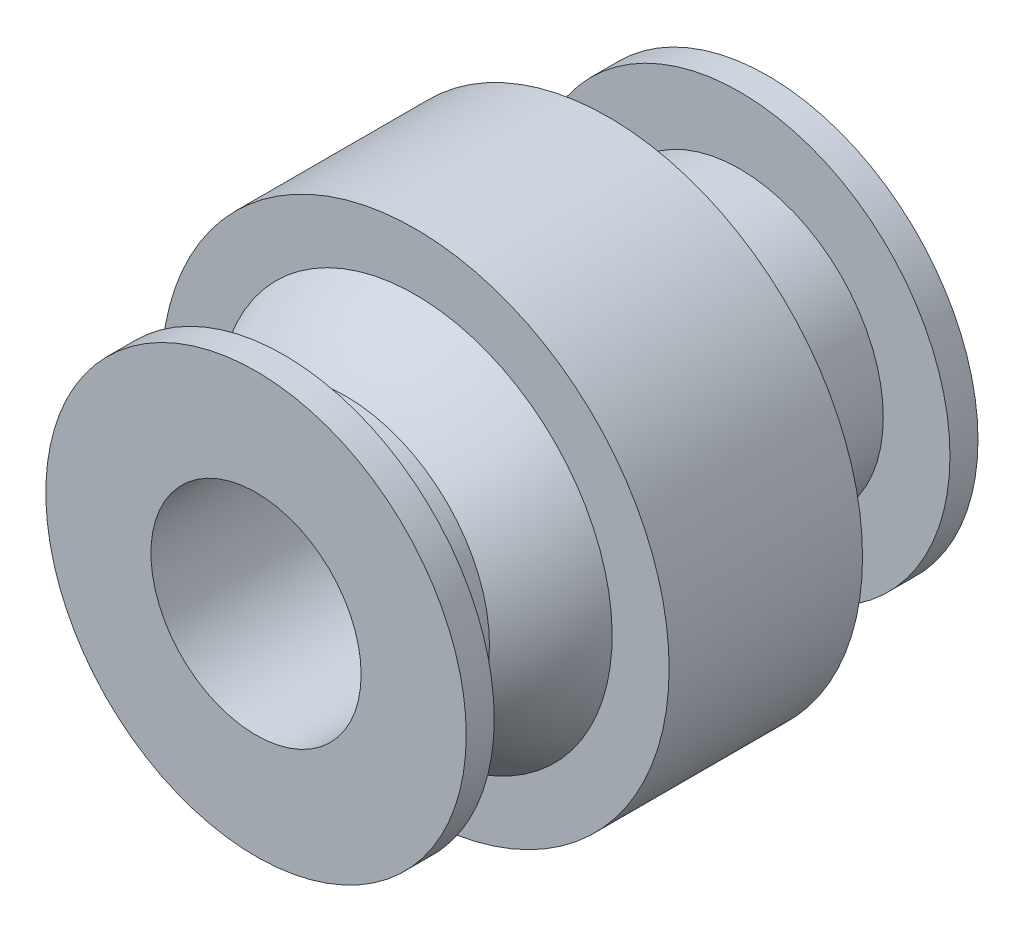
ISO-10303-21;
HEADER;
FILE_DESCRIPTION(('STEP AP214'),'2;1');
FILE_NAME('part.step','',(''),(''),'','','');
FILE_SCHEMA(('AUTOMOTIVE_DESIGN { 1 0 10303 214 1 1 1 1 }'));
ENDSEC;
DATA;
#1=APPLICATION_CONTEXT('core data for automotive mechanical design processes');
#2=APPLICATION_PROTOCOL_DEFINITION('international standard','automotive_design',2000,#1);
#3=PRODUCT_CONTEXT('',#1,'mechanical');
#4=PRODUCT('Part','Part','',(#3));
#5=PRODUCT_RELATED_PRODUCT_CATEGORY('part','',(#4));
#6=PRODUCT_DEFINITION_FORMATION('','',#4);
#7=PRODUCT_DEFINITION_CONTEXT('part definition',#1,'design');
#8=PRODUCT_DEFINITION('design','',#6,#7);
#9=PRODUCT_DEFINITION_SHAPE('','',#8);
#10=(LENGTH_UNIT() NAMED_UNIT(*) SI_UNIT(.MILLI.,.METRE.));
#11=(NAMED_UNIT(*) PLANE_ANGLE_UNIT() SI_UNIT($,.RADIAN.));
#12=(NAMED_UNIT(*) SI_UNIT($,.STERADIAN.) SOLID_ANGLE_UNIT());
#13=UNCERTAINTY_MEASURE_WITH_UNIT(LENGTH_MEASURE(1.E-05),#10,'distance_accuracy_value','');
#14=(GEOMETRIC_REPRESENTATION_CONTEXT(3) GLOBAL_UNCERTAINTY_ASSIGNED_CONTEXT((#13)) GLOBAL_UNIT_ASSIGNED_CONTEXT((#10,
#11,#12)) REPRESENTATION_CONTEXT('',''));
#15=CARTESIAN_POINT('',(0.,0.,0.));
#16=DIRECTION('',(0.,0.,1.));
#17=DIRECTION('',(1.,0.,0.));
#18=AXIS2_PLACEMENT_3D('',#15,#16,#17);
#19=CARTESIAN_POINT('',(0.,-31.574232,-60.7949));
#20=DIRECTION('',(0.,0.,-1.));
#21=DIRECTION('',(-1.,0.,0.));
#22=AXIS2_PLACEMENT_3D('',#19,#20,#21);
#23=PLANE('',#22);
#24=CARTESIAN_POINT('',(0.,-22.049232,-60.7949));
#25=DIRECTION('',(0.,0.,1.));
#26=DIRECTION('',(1.,0.,0.));
#27=AXIS2_PLACEMENT_3D('',#24,#25,#26);
#28=CIRCLE('',#27,6.5024);
#29=CARTESIAN_POINT('',(6.5024,-22.049232,-60.7949));
#30=VERTEX_POINT('',#29);
#31=EDGE_CURVE('E10',#30,#30,#28,.T.);
#32=ORIENTED_EDGE('',*,*,#31,.T.);
#33=EDGE_LOOP('',(#32));
#34=FACE_BOUND('',#33,.T.);
#35=CARTESIAN_POINT('',(0.,-22.049232,-60.7949));
#36=DIRECTION('',(0.,0.,1.));
#37=DIRECTION('',(1.,0.,0.));
#38=AXIS2_PLACEMENT_3D('',#35,#36,#37);
#39=CIRCLE('',#38,9.525);
#40=CARTESIAN_POINT('',(9.525,-22.049232,-60.7949));
#41=VERTEX_POINT('',#40);
#42=EDGE_CURVE('E102',#41,#41,#39,.T.);
#43=ORIENTED_EDGE('',*,*,#42,.F.);
#44=EDGE_LOOP('',(#43));
#45=FACE_BOUND('',#44,.T.);
#46=ADVANCED_FACE('F43',(#34,#45),#23,.T.);
#47=CARTESIAN_POINT('',(0.,-22.049232,-82.1361730867633));
#48=DIRECTION('',(0.,0.,1.));
#49=DIRECTION('',(1.,0.,0.));
#50=AXIS2_PLACEMENT_3D('',#47,#48,#49);
#51=CYLINDRICAL_SURFACE('',#50,6.5024);
#52=CARTESIAN_POINT('',(0.,-22.049232,-63.6000069614774));
#53=DIRECTION('',(0.,0.,1.));
#54=DIRECTION('',(1.,0.,0.));
#55=AXIS2_PLACEMENT_3D('',#52,#53,#54);
#56=CIRCLE('',#55,6.5024);
#57=CARTESIAN_POINT('',(0.,-28.551632,-63.6000069614774));
#58=VERTEX_POINT('',#57);
#59=EDGE_CURVE('E50',#58,#58,#56,.T.);
#60=ORIENTED_EDGE('',*,*,#59,.T.);
#61=EDGE_LOOP('',(#60));
#62=FACE_BOUND('',#61,.T.);
#63=ORIENTED_EDGE('',*,*,#31,.F.);
#64=EDGE_LOOP('',(#63));
#65=FACE_BOUND('',#64,.T.);
#66=ADVANCED_FACE('F111',(#62,#65),#51,.T.);
#67=CARTESIAN_POINT('',(0.,-22.049232,-71.12));
#68=DIRECTION('',(0.,0.,1.));
#69=DIRECTION('',(0.,-1.,0.));
#70=AXIS2_PLACEMENT_3D('',#67,#68,#69);
#71=SPHERICAL_SURFACE('',#70,9.94140337474685);
#72=CARTESIAN_POINT('',(0.,-22.049232,-66.7385));
#73=DIRECTION('',(0.,0.,1.));
#74=DIRECTION('',(1.,0.,0.));
#75=AXIS2_PLACEMENT_3D('',#72,#73,#74);
#76=CIRCLE('',#75,8.92378612526253);
#77=CARTESIAN_POINT('',(0.,-30.9730181252625,-66.7385));
#78=VERTEX_POINT('',#77);
#79=EDGE_CURVE('E55',#78,#78,#76,.T.);
#80=CARTESIAN_POINT('',(0.,-30.9730181252625,-66.7385));
#81=CARTESIAN_POINT('',(0.,-30.9546968172942,-66.7011850210384));
#82=CARTESIAN_POINT('',(0.,-30.9361414336475,-66.6639849715197));
#83=CARTESIAN_POINT('',(0.,-30.8985654926746,-66.5898205560576));
#84=CARTESIAN_POINT('',(0.,-30.8795449353484,-66.5528561901143));
#85=CARTESIAN_POINT('',(0.,-30.8410416246939,-66.4791689664927));
#86=CARTESIAN_POINT('',(0.,-30.8215588713656,-66.4424461088144));
#87=CARTESIAN_POINT('',(0.,-30.7821342387314,-66.3692476784703));
#88=CARTESIAN_POINT('',(0.,-30.7621923594254,-66.3327721058044));
#89=CARTESIAN_POINT('',(0.,-30.7218526118547,-66.2600739859813));
#90=CARTESIAN_POINT('',(0.,-30.7014547435899,-66.2238514388242));
#91=CARTESIAN_POINT('',(0.,-30.6602062282843,-66.1516650699845));
#92=CARTESIAN_POINT('',(0.,-30.6393555812437,-66.115701248302));
#93=CARTESIAN_POINT('',(0.,-30.5972047894432,-66.0440379898545));
#94=CARTESIAN_POINT('',(0.,-30.5759046446834,-66.0083385530896));
#95=CARTESIAN_POINT('',(0.,-30.5328582093371,-65.9372096822646));
#96=CARTESIAN_POINT('',(0.,-30.5111119187507,-65.9017802482044));
#97=CARTESIAN_POINT('',(0.,-30.4671766138237,-65.8311969581013));
#98=CARTESIAN_POINT('',(0.,-30.4449875994832,-65.7960431020582));
#99=CARTESIAN_POINT('',(0.,-30.4001703387966,-65.7260164999317));
#100=CARTESIAN_POINT('',(0.,-30.3775420924505,-65.6911437538483));
#101=CARTESIAN_POINT('',(0.,-30.3318499286185,-65.6216848593482));
#102=CARTESIAN_POINT('',(0.,-30.3087860111326,-65.5870987109315));
#103=CARTESIAN_POINT('',(0.,-30.2622261344462,-65.5182184543714));
#104=CARTESIAN_POINT('',(0.,-30.2387301752457,-65.4839243462281));
#105=CARTESIAN_POINT('',(0.,-30.1913099125428,-65.4156335668651));
#106=CARTESIAN_POINT('',(0.,-30.1673856090403,-65.3816368956454));
#107=CARTESIAN_POINT('',(0.,-30.1191124225522,-65.3139463399739));
#108=CARTESIAN_POINT('',(0.,-30.0947635395665,-65.2802524555222));
#109=CARTESIAN_POINT('',(0.,-30.0456450257438,-65.2131727755835));
#110=CARTESIAN_POINT('',(0.,-30.0208753949069,-65.1797869800965));
#111=CARTESIAN_POINT('',(0.,-29.9709192832243,-65.1133287318019));
#112=CARTESIAN_POINT('',(0.,-29.9457328023786,-65.0802562789943));
#113=CARTESIAN_POINT('',(0.,-29.8949469541182,-65.0144299204645));
#114=CARTESIAN_POINT('',(0.,-29.8693475867035,-64.9816760147422));
#115=CARTESIAN_POINT('',(0.,-29.8177399937179,-64.9164919046612));
#116=CARTESIAN_POINT('',(0.,-29.7917317681471,-64.8840617003024));
#117=CARTESIAN_POINT('',(0.,-29.7393105516018,-64.8195300962874));
#118=CARTESIAN_POINT('',(0.,-29.7128975606273,-64.7874286966313));
#119=CARTESIAN_POINT('',(0.,-29.6596709697226,-64.7235597536191));
#120=CARTESIAN_POINT('',(0.,-29.6328573697924,-64.6917922102631));
#121=CARTESIAN_POINT('',(0.,-29.5788337804654,-64.6285959789114));
#122=CARTESIAN_POINT('',(0.,-29.5516237910686,-64.5971672909158));
#123=CARTESIAN_POINT('',(0.,-29.4968117046751,-64.5346537160218));
#124=CARTESIAN_POINT('',(0.,-29.4692096076784,-64.5035688291235));
#125=CARTESIAN_POINT('',(0.,-29.4136176496549,-64.4417477480594));
#126=CARTESIAN_POINT('',(0.,-29.3856277886281,-64.4110115538935));
#127=CARTESIAN_POINT('',(0.,-29.3292647071351,-64.3498926950573));
#128=CARTESIAN_POINT('',(0.,-29.3008914866688,-64.319510030387));
#129=CARTESIAN_POINT('',(0.,-29.2437661512124,-64.2591030116738));
#130=CARTESIAN_POINT('',(0.,-29.2150140362224,-64.229078657631));
#131=CARTESIAN_POINT('',(0.,-29.157135436264,-64.1693929849136));
#132=CARTESIAN_POINT('',(0.,-29.1280089512957,-64.139731666239));
#133=CARTESIAN_POINT('',(0.,-29.0693861948185,-64.0807767318931));
#134=CARTESIAN_POINT('',(0.,-29.0398899233096,-64.0514831162218));
#135=CARTESIAN_POINT('',(0.,-28.980532235455,-63.9932681975692));
#136=CARTESIAN_POINT('',(0.,-28.9506708191094,-63.964346894588));
#137=CARTESIAN_POINT('',(0.,-28.890587540465,-63.9068811527306));
#138=CARTESIAN_POINT('',(0.,-28.8603656781663,-63.8783367138544));
#139=CARTESIAN_POINT('',(0.,-28.7995662642682,-63.8216291911362));
#140=CARTESIAN_POINT('',(0.,-28.7689887126688,-63.7934661072941));
#141=CARTESIAN_POINT('',(0.,-28.7074827288851,-63.7375257299696));
#142=CARTESIAN_POINT('',(0.,-28.6765542967007,-63.7097484364872));
#143=CARTESIAN_POINT('',(0.,-28.6143514302681,-63.6545839980472));
#144=CARTESIAN_POINT('',(0.,-28.5830769960198,-63.6271968530898));
#145=CARTESIAN_POINT('',(0.,-28.551632,-63.6000069614774));
#146=B_SPLINE_CURVE_WITH_KNOTS('',3,(#80,#81,#82,#83,#84,#85,#86,#87,#88,#89,#90,#91,#92,#93,
#94,#95,#96,#97,#98,#99,#100,#101,#102,#103,#104,#105,#106,#107,#108,#109,#110,#111,#112,#113,
#114,#115,#116,#117,#118,#119,#120,#121,#122,#123,#124,#125,#126,#127,#128,#129,#130,#131,#132,
#133,#134,#135,#136,#137,#138,#139,#140,#141,#142,#143,#144,#145),.UNSPECIFIED.,.F.,.F.,(4,2,2,
2,2,2,2,2,2,2,2,2,2,2,2,2,2,2,2,2,2,2,2,2,2,2,2,2,2,2,2,2,4),(0.,0.124709653743761,
0.249419307487528,0.374128961231285,0.49883861497504,0.62354826871879,0.748257922462551,
0.872967576206311,0.997677229950065,1.12238688369382,1.24709653743757,1.37180619118134,
1.49651584492509,1.62122549866885,1.74593515241261,1.87064480615637,1.99535445990012,
2.12006411364388,2.24477376738763,2.3694834211314,2.49419307487515,2.61890272861891,
2.74361238236267,2.86832203610643,2.99303168985017,3.11774134359393,3.24245099733769,
3.36716065108145,3.4918703048252,3.61657995856896,3.74128961231272,3.86599926605648,
3.99070891980024),.UNSPECIFIED.);
#147=EDGE_CURVE('BSEAM115',#78,#58,#146,.T.);
#148=ORIENTED_EDGE('',*,*,#79,.T.);
#149=ORIENTED_EDGE('',*,*,#59,.F.);
#150=ORIENTED_EDGE('',*,*,#147,.T.);
#151=ORIENTED_EDGE('',*,*,#147,.F.);
#152=EDGE_LOOP('',(#148,#150,#149,#151));
#153=FACE_BOUND('',#152,.T.);
#154=ADVANCED_FACE('F115',(#153),#71,.T.);
#155=CARTESIAN_POINT('',(0.,-30.9730181252625,-66.7385));
#156=DIRECTION('',(0.,0.,1.));
#157=DIRECTION('',(1.,0.,0.));
#158=AXIS2_PLACEMENT_3D('',#155,#156,#157);
#159=PLANE('',#158);
#160=CARTESIAN_POINT('',(0.,-22.049232,-66.7385));
#161=DIRECTION('',(0.,0.,1.));
#162=DIRECTION('',(1.,0.,0.));
#163=AXIS2_PLACEMENT_3D('',#160,#161,#162);
#164=CIRCLE('',#163,11.5062);
#165=CARTESIAN_POINT('',(11.5062,-22.049232,-66.7385));
#166=VERTEX_POINT('',#165);
#167=EDGE_CURVE('E60',#166,#166,#164,.T.);
#168=ORIENTED_EDGE('',*,*,#167,.T.);
#169=EDGE_LOOP('',(#168));
#170=FACE_BOUND('',#169,.T.);
#171=ORIENTED_EDGE('',*,*,#79,.F.);
#172=EDGE_LOOP('',(#171));
#173=FACE_BOUND('',#172,.T.);
#174=ADVANCED_FACE('F119',(#170,#173),#159,.T.);
#175=CARTESIAN_POINT('',(0.,-22.049232,-82.1361730867633));
#176=DIRECTION('',(0.,0.,1.));
#177=DIRECTION('',(1.,0.,0.));
#178=AXIS2_PLACEMENT_3D('',#175,#176,#177);
#179=CYLINDRICAL_SURFACE('',#178,11.5062);
#180=CARTESIAN_POINT('',(0.,-22.049232,-75.5015));
#181=DIRECTION('',(0.,0.,1.));
#182=DIRECTION('',(1.,0.,0.));
#183=AXIS2_PLACEMENT_3D('',#180,#181,#182);
#184=CIRCLE('',#183,11.5062);
#185=CARTESIAN_POINT('',(11.5062,-22.049232,-75.5015));
#186=VERTEX_POINT('',#185);
#187=EDGE_CURVE('E66',#186,#186,#184,.T.);
#188=ORIENTED_EDGE('',*,*,#187,.T.);
#189=EDGE_LOOP('',(#188));
#190=FACE_BOUND('',#189,.T.);
#191=ORIENTED_EDGE('',*,*,#167,.F.);
#192=EDGE_LOOP('',(#191));
#193=FACE_BOUND('',#192,.T.);
#194=ADVANCED_FACE('F126',(#190,#193),#179,.T.);
#195=CARTESIAN_POINT('',(0.,-33.555432,-75.5015));
#196=DIRECTION('',(0.,0.,-1.));
#197=DIRECTION('',(-1.,0.,0.));
#198=AXIS2_PLACEMENT_3D('',#195,#196,#197);
#199=PLANE('',#198);
#200=CARTESIAN_POINT('',(0.,-22.049232,-75.5015));
#201=DIRECTION('',(0.,0.,1.));
#202=DIRECTION('',(1.,0.,0.));
#203=AXIS2_PLACEMENT_3D('',#200,#201,#202);
#204=CIRCLE('',#203,8.92378612526253);
#205=CARTESIAN_POINT('',(0.,-30.9730181252625,-75.5015));
#206=VERTEX_POINT('',#205);
#207=EDGE_CURVE('E70',#206,#206,#204,.T.);
#208=ORIENTED_EDGE('',*,*,#207,.T.);
#209=EDGE_LOOP('',(#208));
#210=FACE_BOUND('',#209,.T.);
#211=ORIENTED_EDGE('',*,*,#187,.F.);
#212=EDGE_LOOP('',(#211));
#213=FACE_BOUND('',#212,.T.);
#214=ADVANCED_FACE('F130',(#210,#213),#199,.T.);
#215=CARTESIAN_POINT('',(0.,-22.049232,-71.12));
#216=DIRECTION('',(0.,0.,1.));
#217=DIRECTION('',(0.,-1.,0.));
#218=AXIS2_PLACEMENT_3D('',#215,#216,#217);
#219=SPHERICAL_SURFACE('',#218,9.94140337474685);
#220=CARTESIAN_POINT('',(0.,-22.049232,-78.6399930385226));
#221=DIRECTION('',(0.,0.,1.));
#222=DIRECTION('',(1.,0.,0.));
#223=AXIS2_PLACEMENT_3D('',#220,#221,#222);
#224=CIRCLE('',#223,6.5024);
#225=CARTESIAN_POINT('',(0.,-28.551632,-78.6399930385226));
#226=VERTEX_POINT('',#225);
#227=EDGE_CURVE('E74',#226,#226,#224,.T.);
#228=CARTESIAN_POINT('',(0.,-28.551632,-78.6399930385226));
#229=CARTESIAN_POINT('',(0.,-28.5830769960198,-78.6128031469102));
#230=CARTESIAN_POINT('',(0.,-28.6143514302681,-78.5854160019528));
#231=CARTESIAN_POINT('',(0.,-28.6765542967007,-78.5302515635128));
#232=CARTESIAN_POINT('',(0.,-28.707482728885,-78.5024742700304));
#233=CARTESIAN_POINT('',(0.,-28.7689887126688,-78.4465338927059));
#234=CARTESIAN_POINT('',(0.,-28.7995662642682,-78.4183708088638));
#235=CARTESIAN_POINT('',(0.,-28.8603656781663,-78.3616632861455));
#236=CARTESIAN_POINT('',(0.,-28.890587540465,-78.3331188472694));
#237=CARTESIAN_POINT('',(0.,-28.9506708191094,-78.275653105412));
#238=CARTESIAN_POINT('',(0.,-28.980532235455,-78.2467318024308));
#239=CARTESIAN_POINT('',(0.,-29.0398899233096,-78.1885168837782));
#240=CARTESIAN_POINT('',(0.,-29.0693861948185,-78.1592232681069));
#241=CARTESIAN_POINT('',(0.,-29.1280089512957,-78.100268333761));
#242=CARTESIAN_POINT('',(0.,-29.157135436264,-78.0706070150864));
#243=CARTESIAN_POINT('',(0.,-29.2150140362223,-78.010921342369));
#244=CARTESIAN_POINT('',(0.,-29.2437661512124,-77.9808969883262));
#245=CARTESIAN_POINT('',(0.,-29.3008914866688,-77.920489969613));
#246=CARTESIAN_POINT('',(0.,-29.3292647071351,-77.8901073049427));
#247=CARTESIAN_POINT('',(0.,-29.3856277886281,-77.8289884461065));
#248=CARTESIAN_POINT('',(0.,-29.4136176496549,-77.7982522519406));
#249=CARTESIAN_POINT('',(0.,-29.4692096076783,-77.7364311708765));
#250=CARTESIAN_POINT('',(0.,-29.4968117046751,-77.7053462839782));
#251=CARTESIAN_POINT('',(0.,-29.5516237910686,-77.6428327090842));
#252=CARTESIAN_POINT('',(0.,-29.5788337804654,-77.6114040210886));
#253=CARTESIAN_POINT('',(0.,-29.6328573697924,-77.5482077897369));
#254=CARTESIAN_POINT('',(0.,-29.6596709697226,-77.5164402463809));
#255=CARTESIAN_POINT('',(0.,-29.7128975606273,-77.4525713033687));
#256=CARTESIAN_POINT('',(0.,-29.7393105516017,-77.4204699037126));
#257=CARTESIAN_POINT('',(0.,-29.791731768147,-77.3559382996976));
#258=CARTESIAN_POINT('',(0.,-29.8177399937179,-77.3235080953388));
#259=CARTESIAN_POINT('',(0.,-29.8693475867035,-77.2583239852578));
#260=CARTESIAN_POINT('',(0.,-29.8949469541182,-77.2255700795355));
#261=CARTESIAN_POINT('',(0.,-29.9457328023786,-77.1597437210056));
#262=CARTESIAN_POINT('',(0.,-29.9709192832243,-77.1266712681981));
#263=CARTESIAN_POINT('',(0.,-30.0208753949069,-77.0602130199035));
#264=CARTESIAN_POINT('',(0.,-30.0456450257438,-77.0268272244165));
#265=CARTESIAN_POINT('',(0.,-30.0947635395665,-76.9597475444778));
#266=CARTESIAN_POINT('',(0.,-30.1191124225522,-76.9260536600261));
#267=CARTESIAN_POINT('',(0.,-30.1673856090403,-76.8583631043546));
#268=CARTESIAN_POINT('',(0.,-30.1913099125428,-76.8243664331349));
#269=CARTESIAN_POINT('',(0.,-30.2387301752457,-76.7560756537719));
#270=CARTESIAN_POINT('',(0.,-30.2622261344462,-76.7217815456286));
#271=CARTESIAN_POINT('',(0.,-30.3087860111326,-76.6529012890685));
#272=CARTESIAN_POINT('',(0.,-30.3318499286185,-76.6183151406518));
#273=CARTESIAN_POINT('',(0.,-30.3775420924505,-76.5488562461517));
#274=CARTESIAN_POINT('',(0.,-30.4001703387966,-76.5139835000683));
#275=CARTESIAN_POINT('',(0.,-30.4449875994832,-76.4439568979418));
#276=CARTESIAN_POINT('',(0.,-30.4671766138237,-76.4088030418987));
#277=CARTESIAN_POINT('',(0.,-30.5111119187507,-76.3382197517955));
#278=CARTESIAN_POINT('',(0.,-30.5328582093371,-76.3027903177354));
#279=CARTESIAN_POINT('',(0.,-30.5759046446834,-76.2316614469104));
#280=CARTESIAN_POINT('',(0.,-30.5972047894432,-76.1959620101455));
#281=CARTESIAN_POINT('',(0.,-30.6393555812437,-76.124298751698));
#282=CARTESIAN_POINT('',(0.,-30.6602062282843,-76.0883349300155));
#283=CARTESIAN_POINT('',(0.,-30.7014547435898,-76.0161485611758));
#284=CARTESIAN_POINT('',(0.,-30.7218526118547,-75.9799260140186));
#285=CARTESIAN_POINT('',(0.,-30.7621923594254,-75.9072278941956));
#286=CARTESIAN_POINT('',(0.,-30.7821342387314,-75.8707523215297));
#287=CARTESIAN_POINT('',(0.,-30.8215588713656,-75.7975538911856));
#288=CARTESIAN_POINT('',(0.,-30.8410416246939,-75.7608310335073));
#289=CARTESIAN_POINT('',(0.,-30.8795449353484,-75.6871438098857));
#290=CARTESIAN_POINT('',(0.,-30.8985654926746,-75.6501794439424));
#291=CARTESIAN_POINT('',(0.,-30.9361414336475,-75.5760150284803));
#292=CARTESIAN_POINT('',(0.,-30.9546968172942,-75.5388149789616));
#293=CARTESIAN_POINT('',(0.,-30.9730181252625,-75.5015));
#294=B_SPLINE_CURVE_WITH_KNOTS('',3,(#228,#229,#230,#231,#232,#233,#234,#235,#236,#237,#238,
#239,#240,#241,#242,#243,#244,#245,#246,#247,#248,#249,#250,#251,#252,#253,#254,#255,#256,#257,
#258,#259,#260,#261,#262,#263,#264,#265,#266,#267,#268,#269,#270,#271,#272,#273,#274,#275,#276,
#277,#278,#279,#280,#281,#282,#283,#284,#285,#286,#287,#288,#289,#290,#291,#292,#293),
.UNSPECIFIED.,.F.,.F.,(4,2,2,2,2,2,2,2,2,2,2,2,2,2,2,2,2,2,2,2,2,2,2,2,2,2,2,2,2,2,2,2,4),(0.,
0.124709653743763,0.249419307487516,0.374128961231278,0.498838614975035,0.623548268718788,
0.748257922462548,0.872967576206305,0.997677229950066,1.12238688369382,1.24709653743757,
1.37180619118134,1.49651584492509,1.62122549866884,1.74593515241261,1.87064480615636,
1.99535445990012,2.12006411364387,2.24477376738764,2.3694834211314,2.49419307487515,
2.61890272861891,2.74361238236267,2.86832203610642,2.99303168985018,3.11774134359393,
3.24245099733769,3.36716065108146,3.49187030482521,3.61657995856897,3.74128961231272,
3.86599926605648,3.99070891980023),.UNSPECIFIED.);
#295=EDGE_CURVE('BSEAM134',#226,#206,#294,.T.);
#296=ORIENTED_EDGE('',*,*,#227,.T.);
#297=ORIENTED_EDGE('',*,*,#207,.F.);
#298=ORIENTED_EDGE('',*,*,#295,.T.);
#299=ORIENTED_EDGE('',*,*,#295,.F.);
#300=EDGE_LOOP('',(#296,#298,#297,#299));
#301=FACE_BOUND('',#300,.T.);
#302=ADVANCED_FACE('F134',(#301),#219,.T.);
#303=CARTESIAN_POINT('',(0.,-22.049232,-82.1361730867633));
#304=DIRECTION('',(0.,0.,1.));
#305=DIRECTION('',(1.,0.,0.));
#306=AXIS2_PLACEMENT_3D('',#303,#304,#305);
#307=CYLINDRICAL_SURFACE('',#306,6.5024);
#308=CARTESIAN_POINT('',(0.,-22.049232,-81.4451));
#309=DIRECTION('',(0.,0.,1.));
#310=DIRECTION('',(1.,0.,0.));
#311=AXIS2_PLACEMENT_3D('',#308,#309,#310);
#312=CIRCLE('',#311,6.5024);
#313=CARTESIAN_POINT('',(6.5024,-22.049232,-81.4451));
#314=VERTEX_POINT('',#313);
#315=EDGE_CURVE('E78',#314,#314,#312,.T.);
#316=ORIENTED_EDGE('',*,*,#315,.T.);
#317=EDGE_LOOP('',(#316));
#318=FACE_BOUND('',#317,.T.);
#319=ORIENTED_EDGE('',*,*,#227,.F.);
#320=EDGE_LOOP('',(#319));
#321=FACE_BOUND('',#320,.T.);
#322=ADVANCED_FACE('F138',(#318,#321),#307,.T.);
#323=CARTESIAN_POINT('',(0.,-28.551632,-81.4451));
#324=DIRECTION('',(0.,0.,1.));
#325=DIRECTION('',(1.,0.,0.));
#326=AXIS2_PLACEMENT_3D('',#323,#324,#325);
#327=PLANE('',#326);
#328=CARTESIAN_POINT('',(0.,-22.049232,-81.4451));
#329=DIRECTION('',(0.,0.,1.));
#330=DIRECTION('',(1.,0.,0.));
#331=AXIS2_PLACEMENT_3D('',#328,#329,#330);
#332=CIRCLE('',#331,9.525);
#333=CARTESIAN_POINT('',(9.525,-22.049232,-81.4451));
#334=VERTEX_POINT('',#333);
#335=EDGE_CURVE('E82',#334,#334,#332,.T.);
#336=ORIENTED_EDGE('',*,*,#335,.T.);
#337=EDGE_LOOP('',(#336));
#338=FACE_BOUND('',#337,.T.);
#339=ORIENTED_EDGE('',*,*,#315,.F.);
#340=EDGE_LOOP('',(#339));
#341=FACE_BOUND('',#340,.T.);
#342=ADVANCED_FACE('F142',(#338,#341),#327,.T.);
#343=CARTESIAN_POINT('',(0.,-22.049232,-82.1361730867633));
#344=DIRECTION('',(0.,0.,1.));
#345=DIRECTION('',(1.,0.,0.));
#346=AXIS2_PLACEMENT_3D('',#343,#344,#345);
#347=CYLINDRICAL_SURFACE('',#346,9.525);
#348=CARTESIAN_POINT('',(0.,-22.049232,-82.7151));
#349=DIRECTION('',(0.,0.,1.));
#350=DIRECTION('',(1.,0.,0.));
#351=AXIS2_PLACEMENT_3D('',#348,#349,#350);
#352=CIRCLE('',#351,9.525);
#353=CARTESIAN_POINT('',(9.525,-22.049232,-82.7151));
#354=VERTEX_POINT('',#353);
#355=EDGE_CURVE('E86',#354,#354,#352,.T.);
#356=ORIENTED_EDGE('',*,*,#355,.T.);
#357=EDGE_LOOP('',(#356));
#358=FACE_BOUND('',#357,.T.);
#359=ORIENTED_EDGE('',*,*,#335,.F.);
#360=EDGE_LOOP('',(#359));
#361=FACE_BOUND('',#360,.T.);
#362=ADVANCED_FACE('F146',(#358,#361),#347,.T.);
#363=CARTESIAN_POINT('',(0.,-31.574232,-82.7151));
#364=DIRECTION('',(0.,0.,-1.));
#365=DIRECTION('',(-1.,0.,0.));
#366=AXIS2_PLACEMENT_3D('',#363,#364,#365);
#367=PLANE('',#366);
#368=CARTESIAN_POINT('',(0.,-22.049232,-82.7151));
#369=DIRECTION('',(0.,0.,1.));
#370=DIRECTION('',(1.,0.,0.));
#371=AXIS2_PLACEMENT_3D('',#368,#369,#370);
#372=CIRCLE('',#371,4.7625);
#373=CARTESIAN_POINT('',(4.7625,-22.049232,-82.7151));
#374=VERTEX_POINT('',#373);
#375=EDGE_CURVE('E90',#374,#374,#372,.T.);
#376=ORIENTED_EDGE('',*,*,#375,.T.);
#377=EDGE_LOOP('',(#376));
#378=FACE_BOUND('',#377,.T.);
#379=ORIENTED_EDGE('',*,*,#355,.F.);
#380=EDGE_LOOP('',(#379));
#381=FACE_BOUND('',#380,.T.);
#382=ADVANCED_FACE('F150',(#378,#381),#367,.T.);
#383=CARTESIAN_POINT('',(0.,-22.049232,-82.1361730867633));
#384=DIRECTION('',(0.,0.,1.));
#385=DIRECTION('',(1.,0.,0.));
#386=AXIS2_PLACEMENT_3D('',#383,#384,#385);
#387=CYLINDRICAL_SURFACE('',#386,4.7625);
#388=CARTESIAN_POINT('',(0.,-22.049232,-59.5249));
#389=DIRECTION('',(0.,0.,1.));
#390=DIRECTION('',(1.,0.,0.));
#391=AXIS2_PLACEMENT_3D('',#388,#389,#390);
#392=CIRCLE('',#391,4.7625);
#393=CARTESIAN_POINT('',(4.7625,-22.049232,-59.5249));
#394=VERTEX_POINT('',#393);
#395=EDGE_CURVE('E94',#394,#394,#392,.T.);
#396=ORIENTED_EDGE('',*,*,#395,.T.);
#397=EDGE_LOOP('',(#396));
#398=FACE_BOUND('',#397,.T.);
#399=ORIENTED_EDGE('',*,*,#375,.F.);
#400=EDGE_LOOP('',(#399));
#401=FACE_BOUND('',#400,.T.);
#402=ADVANCED_FACE('F154',(#398,#401),#387,.F.);
#403=CARTESIAN_POINT('',(0.,-26.811732,-59.5249));
#404=DIRECTION('',(0.,0.,1.));
#405=DIRECTION('',(1.,0.,0.));
#406=AXIS2_PLACEMENT_3D('',#403,#404,#405);
#407=PLANE('',#406);
#408=CARTESIAN_POINT('',(0.,-22.049232,-59.5249));
#409=DIRECTION('',(0.,0.,1.));
#410=DIRECTION('',(1.,0.,0.));
#411=AXIS2_PLACEMENT_3D('',#408,#409,#410);
#412=CIRCLE('',#411,9.525);
#413=CARTESIAN_POINT('',(9.525,-22.049232,-59.5249));
#414=VERTEX_POINT('',#413);
#415=EDGE_CURVE('E98',#414,#414,#412,.T.);
#416=ORIENTED_EDGE('',*,*,#415,.T.);
#417=EDGE_LOOP('',(#416));
#418=FACE_BOUND('',#417,.T.);
#419=ORIENTED_EDGE('',*,*,#395,.F.);
#420=EDGE_LOOP('',(#419));
#421=FACE_BOUND('',#420,.T.);
#422=ADVANCED_FACE('F158',(#418,#421),#407,.T.);
#423=CARTESIAN_POINT('',(0.,-22.049232,-82.1361730867633));
#424=DIRECTION('',(0.,0.,1.));
#425=DIRECTION('',(1.,0.,0.));
#426=AXIS2_PLACEMENT_3D('',#423,#424,#425);
#427=CYLINDRICAL_SURFACE('',#426,9.525);
#428=ORIENTED_EDGE('',*,*,#42,.T.);
#429=EDGE_LOOP('',(#428));
#430=FACE_BOUND('',#429,.T.);
#431=ORIENTED_EDGE('',*,*,#415,.F.);
#432=EDGE_LOOP('',(#431));
#433=FACE_BOUND('',#432,.T.);
#434=ADVANCED_FACE('F107',(#430,#433),#427,.T.);
#435=CLOSED_SHELL('',(#46,#66,#154,#174,#194,#214,#302,#322,#342,#362,#382,#402,#422,#434));
#436=MANIFOLD_SOLID_BREP('B2',#435);
#437=ADVANCED_BREP_SHAPE_REPRESENTATION('',(#18,#436),#14);
#438=SHAPE_DEFINITION_REPRESENTATION(#9,#437);
ENDSEC;
END-ISO-10303-21;
